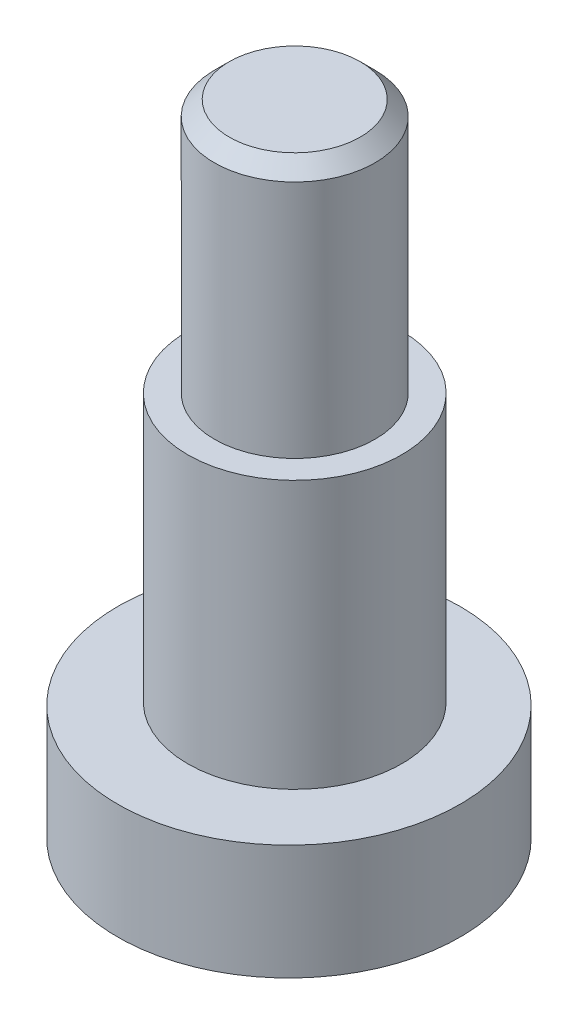
ISO-10303-21;
HEADER;
FILE_DESCRIPTION(('STEP AP214'),'2;1');
FILE_NAME('part.step','',(''),(''),'','','');
FILE_SCHEMA(('AUTOMOTIVE_DESIGN { 1 0 10303 214 1 1 1 1 }'));
ENDSEC;
DATA;
#1=APPLICATION_CONTEXT('core data for automotive mechanical design processes');
#2=APPLICATION_PROTOCOL_DEFINITION('international standard','automotive_design',2000,#1);
#3=PRODUCT_CONTEXT('',#1,'mechanical');
#4=PRODUCT('Part','Part','',(#3));
#5=PRODUCT_RELATED_PRODUCT_CATEGORY('part','',(#4));
#6=PRODUCT_DEFINITION_FORMATION('','',#4);
#7=PRODUCT_DEFINITION_CONTEXT('part definition',#1,'design');
#8=PRODUCT_DEFINITION('design','',#6,#7);
#9=PRODUCT_DEFINITION_SHAPE('','',#8);
#10=(LENGTH_UNIT() NAMED_UNIT(*) SI_UNIT(.MILLI.,.METRE.));
#11=(NAMED_UNIT(*) PLANE_ANGLE_UNIT() SI_UNIT($,.RADIAN.));
#12=(NAMED_UNIT(*) SI_UNIT($,.STERADIAN.) SOLID_ANGLE_UNIT());
#13=UNCERTAINTY_MEASURE_WITH_UNIT(LENGTH_MEASURE(1.E-05),#10,'distance_accuracy_value','');
#14=(GEOMETRIC_REPRESENTATION_CONTEXT(3) GLOBAL_UNCERTAINTY_ASSIGNED_CONTEXT((#13)) GLOBAL_UNIT_ASSIGNED_CONTEXT((#10,
#11,#12)) REPRESENTATION_CONTEXT('',''));
#15=CARTESIAN_POINT('',(0.,0.,0.));
#16=DIRECTION('',(0.,0.,1.));
#17=DIRECTION('',(1.,0.,0.));
#18=AXIS2_PLACEMENT_3D('',#15,#16,#17);
#19=CARTESIAN_POINT('',(0.,4.3,0.216468968283874));
#20=DIRECTION('',(0.,-1.,0.));
#21=DIRECTION('',(0.,0.,-1.));
#22=AXIS2_PLACEMENT_3D('',#19,#20,#21);
#23=CYLINDRICAL_SURFACE('',#22,6.4);
#24=CARTESIAN_POINT('',(0.,4.3,0.216468968283874));
#25=DIRECTION('',(0.,1.,0.));
#26=DIRECTION('',(0.,0.,1.));
#27=AXIS2_PLACEMENT_3D('',#24,#25,#26);
#28=CIRCLE('',#27,6.4);
#29=CARTESIAN_POINT('',(0.,4.3,-6.18353103171613));
#30=VERTEX_POINT('',#29);
#31=EDGE_CURVE('E163',#30,#30,#28,.T.);
#32=CARTESIAN_POINT('',(0.,0.,0.216468968283874));
#33=DIRECTION('',(0.,1.,0.));
#34=DIRECTION('',(0.,0.,1.));
#35=AXIS2_PLACEMENT_3D('',#32,#33,#34);
#36=CIRCLE('',#35,6.4);
#37=CARTESIAN_POINT('',(0.,0.,-6.18353103171613));
#38=VERTEX_POINT('',#37);
#39=EDGE_CURVE('E48',#38,#38,#36,.T.);
#40=CARTESIAN_POINT('',(0.,4.3,-6.18353103171613));
#41=CARTESIAN_POINT('',(0.,4.25520833333333,-6.18353103171613));
#42=CARTESIAN_POINT('',(0.,4.21041666666667,-6.18353103171613));
#43=CARTESIAN_POINT('',(0.,4.12083333333333,-6.18353103171613));
#44=CARTESIAN_POINT('',(0.,4.07604166666667,-6.18353103171613));
#45=CARTESIAN_POINT('',(0.,3.98645833333333,-6.18353103171613));
#46=CARTESIAN_POINT('',(0.,3.94166666666667,-6.18353103171613));
#47=CARTESIAN_POINT('',(0.,3.85208333333333,-6.18353103171613));
#48=CARTESIAN_POINT('',(0.,3.80729166666667,-6.18353103171613));
#49=CARTESIAN_POINT('',(0.,3.71770833333333,-6.18353103171613));
#50=CARTESIAN_POINT('',(0.,3.67291666666667,-6.18353103171613));
#51=CARTESIAN_POINT('',(0.,3.58333333333333,-6.18353103171613));
#52=CARTESIAN_POINT('',(0.,3.53854166666667,-6.18353103171613));
#53=CARTESIAN_POINT('',(0.,3.44895833333333,-6.18353103171613));
#54=CARTESIAN_POINT('',(0.,3.40416666666667,-6.18353103171613));
#55=CARTESIAN_POINT('',(0.,3.31458333333333,-6.18353103171613));
#56=CARTESIAN_POINT('',(0.,3.26979166666667,-6.18353103171613));
#57=CARTESIAN_POINT('',(0.,3.18020833333333,-6.18353103171613));
#58=CARTESIAN_POINT('',(0.,3.13541666666667,-6.18353103171613));
#59=CARTESIAN_POINT('',(0.,3.04583333333333,-6.18353103171613));
#60=CARTESIAN_POINT('',(0.,3.00104166666667,-6.18353103171613));
#61=CARTESIAN_POINT('',(0.,2.91145833333333,-6.18353103171613));
#62=CARTESIAN_POINT('',(0.,2.86666666666667,-6.18353103171613));
#63=CARTESIAN_POINT('',(0.,2.77708333333333,-6.18353103171613));
#64=CARTESIAN_POINT('',(0.,2.73229166666667,-6.18353103171613));
#65=CARTESIAN_POINT('',(0.,2.64270833333333,-6.18353103171613));
#66=CARTESIAN_POINT('',(0.,2.59791666666667,-6.18353103171613));
#67=CARTESIAN_POINT('',(0.,2.50833333333333,-6.18353103171613));
#68=CARTESIAN_POINT('',(0.,2.46354166666667,-6.18353103171613));
#69=CARTESIAN_POINT('',(0.,2.37395833333333,-6.18353103171613));
#70=CARTESIAN_POINT('',(0.,2.32916666666667,-6.18353103171613));
#71=CARTESIAN_POINT('',(0.,2.23958333333333,-6.18353103171613));
#72=CARTESIAN_POINT('',(0.,2.19479166666667,-6.18353103171613));
#73=CARTESIAN_POINT('',(0.,2.10520833333333,-6.18353103171613));
#74=CARTESIAN_POINT('',(0.,2.06041666666667,-6.18353103171613));
#75=CARTESIAN_POINT('',(0.,1.97083333333333,-6.18353103171613));
#76=CARTESIAN_POINT('',(0.,1.92604166666667,-6.18353103171613));
#77=CARTESIAN_POINT('',(0.,1.83645833333333,-6.18353103171613));
#78=CARTESIAN_POINT('',(0.,1.79166666666667,-6.18353103171613));
#79=CARTESIAN_POINT('',(0.,1.70208333333333,-6.18353103171613));
#80=CARTESIAN_POINT('',(0.,1.65729166666667,-6.18353103171613));
#81=CARTESIAN_POINT('',(0.,1.56770833333333,-6.18353103171613));
#82=CARTESIAN_POINT('',(0.,1.52291666666667,-6.18353103171613));
#83=CARTESIAN_POINT('',(0.,1.43333333333333,-6.18353103171613));
#84=CARTESIAN_POINT('',(0.,1.38854166666667,-6.18353103171613));
#85=CARTESIAN_POINT('',(0.,1.29895833333333,-6.18353103171613));
#86=CARTESIAN_POINT('',(0.,1.25416666666667,-6.18353103171613));
#87=CARTESIAN_POINT('',(0.,1.16458333333333,-6.18353103171613));
#88=CARTESIAN_POINT('',(0.,1.11979166666667,-6.18353103171613));
#89=CARTESIAN_POINT('',(0.,1.03020833333333,-6.18353103171613));
#90=CARTESIAN_POINT('',(0.,0.985416666666665,-6.18353103171613));
#91=CARTESIAN_POINT('',(0.,0.895833333333332,-6.18353103171613));
#92=CARTESIAN_POINT('',(0.,0.851041666666665,-6.18353103171613));
#93=CARTESIAN_POINT('',(0.,0.761458333333332,-6.18353103171613));
#94=CARTESIAN_POINT('',(0.,0.716666666666665,-6.18353103171613));
#95=CARTESIAN_POINT('',(0.,0.627083333333332,-6.18353103171613));
#96=CARTESIAN_POINT('',(0.,0.582291666666665,-6.18353103171613));
#97=CARTESIAN_POINT('',(0.,0.492708333333332,-6.18353103171613));
#98=CARTESIAN_POINT('',(0.,0.447916666666665,-6.18353103171613));
#99=CARTESIAN_POINT('',(0.,0.358333333333332,-6.18353103171613));
#100=CARTESIAN_POINT('',(0.,0.313541666666666,-6.18353103171613));
#101=CARTESIAN_POINT('',(0.,0.223958333333332,-6.18353103171613));
#102=CARTESIAN_POINT('',(0.,0.179166666666666,-6.18353103171613));
#103=CARTESIAN_POINT('',(0.,0.0895833333333324,-6.18353103171613));
#104=CARTESIAN_POINT('',(0.,0.0447916666666658,-6.18353103171613));
#105=CARTESIAN_POINT('',(0.,0.,-6.18353103171613));
#106=B_SPLINE_CURVE_WITH_KNOTS('',3,(#40,#41,#42,#43,#44,#45,#46,#47,#48,#49,#50,#51,#52,#53,
#54,#55,#56,#57,#58,#59,#60,#61,#62,#63,#64,#65,#66,#67,#68,#69,#70,#71,#72,#73,#74,#75,#76,#77,
#78,#79,#80,#81,#82,#83,#84,#85,#86,#87,#88,#89,#90,#91,#92,#93,#94,#95,#96,#97,#98,#99,#100,
#101,#102,#103,#104,#105),.UNSPECIFIED.,.F.,.F.,(4,2,2,2,2,2,2,2,2,2,2,2,2,2,2,2,2,2,2,2,2,2,2,
2,2,2,2,2,2,2,2,2,4),(0.,0.134375000000001,0.268750000000001,0.403125000000001,
0.537500000000001,0.671875000000001,0.806250000000001,0.940625,1.075,1.209375,1.34375,1.478125,
1.6125,1.746875,1.88125,2.015625,2.15,2.284375,2.41875,2.553125,2.6875,2.821875,2.95625,
3.090625,3.225,3.359375,3.49375,3.628125,3.7625,3.896875,4.03125,4.165625,4.3),.UNSPECIFIED.);
#107=EDGE_CURVE('BSEAM45',#30,#38,#106,.T.);
#108=ORIENTED_EDGE('',*,*,#31,.F.);
#109=ORIENTED_EDGE('',*,*,#39,.T.);
#110=ORIENTED_EDGE('',*,*,#107,.T.);
#111=ORIENTED_EDGE('',*,*,#107,.F.);
#112=EDGE_LOOP('',(#108,#110,#109,#111));
#113=FACE_BOUND('',#112,.T.);
#114=ADVANCED_FACE('F45',(#113),#23,.T.);
#115=CARTESIAN_POINT('',(0.,4.3,0.216468968283874));
#116=DIRECTION('',(0.,1.,0.));
#117=DIRECTION('',(0.,0.,1.));
#118=AXIS2_PLACEMENT_3D('',#115,#116,#117);
#119=PLANE('',#118);
#120=CARTESIAN_POINT('',(0.,4.3,0.));
#121=DIRECTION('',(0.,1.,0.));
#122=DIRECTION('',(0.,0.,1.));
#123=AXIS2_PLACEMENT_3D('',#120,#121,#122);
#124=CIRCLE('',#123,4.);
#125=CARTESIAN_POINT('',(0.,4.3,4.));
#126=VERTEX_POINT('',#125);
#127=EDGE_CURVE('E53',#126,#126,#124,.T.);
#128=ORIENTED_EDGE('',*,*,#127,.F.);
#129=EDGE_LOOP('',(#128));
#130=FACE_BOUND('',#129,.T.);
#131=ORIENTED_EDGE('',*,*,#31,.T.);
#132=EDGE_LOOP('',(#131));
#133=FACE_BOUND('',#132,.T.);
#134=ADVANCED_FACE('F174',(#130,#133),#119,.T.);
#135=CARTESIAN_POINT('',(0.,0.,0.216468968283874));
#136=DIRECTION('',(0.,1.,0.));
#137=DIRECTION('',(0.,0.,1.));
#138=AXIS2_PLACEMENT_3D('',#135,#136,#137);
#139=PLANE('',#138);
#140=DIRECTION('',(-0.5,0.,0.866025403784439));
#141=VECTOR('',#140,1.);
#142=CARTESIAN_POINT('',(1.8475208614068,0.,0.));
#143=LINE('',#142,#141);
#144=CARTESIAN_POINT('',(1.8475208614068,0.,0.));
#145=VERTEX_POINT('',#144);
#146=CARTESIAN_POINT('',(0.923760430703402,0.,1.6));
#147=VERTEX_POINT('',#146);
#148=EDGE_CURVE('E135',#145,#147,#143,.T.);
#149=ORIENTED_EDGE('',*,*,#148,.F.);
#150=DIRECTION('',(0.5,0.,0.866025403784439));
#151=VECTOR('',#150,1.);
#152=CARTESIAN_POINT('',(0.923760430703402,0.,-1.6));
#153=LINE('',#152,#151);
#154=CARTESIAN_POINT('',(0.923760430703402,0.,-1.6));
#155=VERTEX_POINT('',#154);
#156=EDGE_CURVE('E61',#155,#145,#153,.T.);
#157=ORIENTED_EDGE('',*,*,#156,.F.);
#158=DIRECTION('',(1.,0.,0.));
#159=VECTOR('',#158,1.);
#160=CARTESIAN_POINT('',(-0.923760430703402,0.,-1.6));
#161=LINE('',#160,#159);
#162=CARTESIAN_POINT('',(-0.923760430703402,0.,-1.6));
#163=VERTEX_POINT('',#162);
#164=EDGE_CURVE('E144',#163,#155,#161,.T.);
#165=ORIENTED_EDGE('',*,*,#164,.F.);
#166=DIRECTION('',(0.5,0.,-0.866025403784439));
#167=VECTOR('',#166,1.);
#168=CARTESIAN_POINT('',(-1.8475208614068,0.,0.));
#169=LINE('',#168,#167);
#170=CARTESIAN_POINT('',(-1.8475208614068,0.,0.));
#171=VERTEX_POINT('',#170);
#172=EDGE_CURVE('E142',#171,#163,#169,.T.);
#173=ORIENTED_EDGE('',*,*,#172,.F.);
#174=DIRECTION('',(-0.5,0.,-0.866025403784439));
#175=VECTOR('',#174,1.);
#176=CARTESIAN_POINT('',(-0.923760430703402,0.,1.6));
#177=LINE('',#176,#175);
#178=CARTESIAN_POINT('',(-0.923760430703402,0.,1.6));
#179=VERTEX_POINT('',#178);
#180=EDGE_CURVE('E109',#179,#171,#177,.T.);
#181=ORIENTED_EDGE('',*,*,#180,.F.);
#182=DIRECTION('',(-1.,0.,0.));
#183=VECTOR('',#182,1.);
#184=CARTESIAN_POINT('',(0.923760430703402,0.,1.6));
#185=LINE('',#184,#183);
#186=EDGE_CURVE('E138',#147,#179,#185,.T.);
#187=ORIENTED_EDGE('',*,*,#186,.F.);
#188=EDGE_LOOP('',(#149,#157,#165,#173,#181,#187));
#189=FACE_BOUND('',#188,.T.);
#190=ORIENTED_EDGE('',*,*,#39,.F.);
#191=EDGE_LOOP('',(#190));
#192=FACE_BOUND('',#191,.T.);
#193=ADVANCED_FACE('F171',(#189,#192),#139,.F.);
#194=CARTESIAN_POINT('',(0.,14.3,0.));
#195=DIRECTION('',(0.,-1.,0.));
#196=DIRECTION('',(0.,0.,-1.));
#197=AXIS2_PLACEMENT_3D('',#194,#195,#196);
#198=CYLINDRICAL_SURFACE('',#197,4.);
#199=CARTESIAN_POINT('',(0.,14.3,0.));
#200=DIRECTION('',(0.,1.,0.));
#201=DIRECTION('',(0.,0.,1.));
#202=AXIS2_PLACEMENT_3D('',#199,#200,#201);
#203=CIRCLE('',#202,4.);
#204=CARTESIAN_POINT('',(0.,14.3,4.));
#205=VERTEX_POINT('',#204);
#206=EDGE_CURVE('E158',#205,#205,#203,.T.);
#207=ORIENTED_EDGE('',*,*,#206,.F.);
#208=EDGE_LOOP('',(#207));
#209=FACE_BOUND('',#208,.T.);
#210=ORIENTED_EDGE('',*,*,#127,.T.);
#211=EDGE_LOOP('',(#210));
#212=FACE_BOUND('',#211,.T.);
#213=ADVANCED_FACE('F173',(#209,#212),#198,.T.);
#214=CARTESIAN_POINT('',(0.,14.3,0.));
#215=DIRECTION('',(0.,1.,0.));
#216=DIRECTION('',(0.,0.,1.));
#217=AXIS2_PLACEMENT_3D('',#214,#215,#216);
#218=PLANE('',#217);
#219=CARTESIAN_POINT('',(0.,14.3,0.));
#220=DIRECTION('',(0.,1.,0.));
#221=DIRECTION('',(0.,0.,1.));
#222=AXIS2_PLACEMENT_3D('',#219,#220,#221);
#223=CIRCLE('',#222,3.);
#224=CARTESIAN_POINT('',(0.,14.3,3.));
#225=VERTEX_POINT('',#224);
#226=EDGE_CURVE('E11',#225,#225,#223,.T.);
#227=ORIENTED_EDGE('',*,*,#226,.F.);
#228=EDGE_LOOP('',(#227));
#229=FACE_BOUND('',#228,.T.);
#230=ORIENTED_EDGE('',*,*,#206,.T.);
#231=EDGE_LOOP('',(#230));
#232=FACE_BOUND('',#231,.T.);
#233=ADVANCED_FACE('F181',(#229,#232),#218,.T.);
#234=CARTESIAN_POINT('',(0.,23.8,0.));
#235=DIRECTION('',(0.,-1.,0.));
#236=DIRECTION('',(0.,0.,-1.));
#237=AXIS2_PLACEMENT_3D('',#234,#235,#236);
#238=CYLINDRICAL_SURFACE('',#237,3.);
#239=CARTESIAN_POINT('',(0.,23.2455,0.));
#240=DIRECTION('',(0.,-1.,0.));
#241=DIRECTION('',(0.,0.,-1.));
#242=AXIS2_PLACEMENT_3D('',#239,#240,#241);
#243=CIRCLE('',#242,3.);
#244=CARTESIAN_POINT('',(0.,23.2455,-3.));
#245=VERTEX_POINT('',#244);
#246=EDGE_CURVE('E156',#245,#245,#243,.T.);
#247=ORIENTED_EDGE('',*,*,#246,.T.);
#248=EDGE_LOOP('',(#247));
#249=FACE_BOUND('',#248,.T.);
#250=ORIENTED_EDGE('',*,*,#226,.T.);
#251=EDGE_LOOP('',(#250));
#252=FACE_BOUND('',#251,.T.);
#253=ADVANCED_FACE('F209',(#249,#252),#238,.T.);
#254=CARTESIAN_POINT('',(0.,23.8,0.));
#255=DIRECTION('',(0.,-1.,0.));
#256=DIRECTION('',(0.,0.,-1.));
#257=AXIS2_PLACEMENT_3D('',#254,#255,#256);
#258=CONICAL_SURFACE('',#257,2.4455,0.785398163397464);
#259=ORIENTED_EDGE('',*,*,#246,.F.);
#260=EDGE_LOOP('',(#259));
#261=FACE_BOUND('',#260,.T.);
#262=CARTESIAN_POINT('',(0.,23.8,0.));
#263=DIRECTION('',(0.,-1.,0.));
#264=DIRECTION('',(0.,0.,-1.));
#265=AXIS2_PLACEMENT_3D('',#262,#263,#264);
#266=CIRCLE('',#265,2.4455);
#267=CARTESIAN_POINT('',(0.,23.8,-2.4455));
#268=VERTEX_POINT('',#267);
#269=EDGE_CURVE('E148',#268,#268,#266,.T.);
#270=ORIENTED_EDGE('',*,*,#269,.T.);
#271=EDGE_LOOP('',(#270));
#272=FACE_BOUND('',#271,.T.);
#273=ADVANCED_FACE('F220',(#261,#272),#258,.T.);
#274=CARTESIAN_POINT('',(0.,23.8,0.));
#275=DIRECTION('',(0.,1.,0.));
#276=DIRECTION('',(0.,0.,1.));
#277=AXIS2_PLACEMENT_3D('',#274,#275,#276);
#278=PLANE('',#277);
#279=ORIENTED_EDGE('',*,*,#269,.F.);
#280=EDGE_LOOP('',(#279));
#281=FACE_BOUND('',#280,.T.);
#282=ADVANCED_FACE('F231',(#281),#278,.T.);
#283=CARTESIAN_POINT('',(0.923760430703402,2.,-1.6));
#284=DIRECTION('',(0.866025403784439,0.,-0.5));
#285=DIRECTION('',(-0.5,0.,-0.866025403784439));
#286=AXIS2_PLACEMENT_3D('',#283,#284,#285);
#287=PLANE('',#286);
#288=ORIENTED_EDGE('',*,*,#156,.T.);
#289=DIRECTION('',(0.,-1.,0.));
#290=VECTOR('',#289,1.);
#291=CARTESIAN_POINT('',(1.8475208614068,2.,0.));
#292=LINE('',#291,#290);
#293=CARTESIAN_POINT('',(1.8475208614068,2.,0.));
#294=VERTEX_POINT('',#293);
#295=EDGE_CURVE('E91',#294,#145,#292,.T.);
#296=ORIENTED_EDGE('',*,*,#295,.F.);
#297=DIRECTION('',(0.5,0.,0.866025403784439));
#298=VECTOR('',#297,1.);
#299=CARTESIAN_POINT('',(0.923760430703402,2.,-1.6));
#300=LINE('',#299,#298);
#301=CARTESIAN_POINT('',(0.923760430703402,2.,-1.6));
#302=VERTEX_POINT('',#301);
#303=EDGE_CURVE('E146',#302,#294,#300,.T.);
#304=ORIENTED_EDGE('',*,*,#303,.F.);
#305=DIRECTION('',(0.,-1.,0.));
#306=VECTOR('',#305,1.);
#307=CARTESIAN_POINT('',(0.923760430703402,2.,-1.6));
#308=LINE('',#307,#306);
#309=EDGE_CURVE('E69',#302,#155,#308,.T.);
#310=ORIENTED_EDGE('',*,*,#309,.T.);
#311=EDGE_LOOP('',(#288,#296,#304,#310));
#312=FACE_BOUND('',#311,.T.);
#313=ADVANCED_FACE('F240',(#312),#287,.F.);
#314=CARTESIAN_POINT('',(-0.923760430703402,2.,-1.6));
#315=DIRECTION('',(0.,0.,-1.));
#316=DIRECTION('',(-1.,0.,0.));
#317=AXIS2_PLACEMENT_3D('',#314,#315,#316);
#318=PLANE('',#317);
#319=ORIENTED_EDGE('',*,*,#164,.T.);
#320=ORIENTED_EDGE('',*,*,#309,.F.);
#321=DIRECTION('',(1.,0.,0.));
#322=VECTOR('',#321,1.);
#323=CARTESIAN_POINT('',(-0.923760430703402,2.,-1.6));
#324=LINE('',#323,#322);
#325=CARTESIAN_POINT('',(-0.923760430703402,2.,-1.6));
#326=VERTEX_POINT('',#325);
#327=EDGE_CURVE('E121',#326,#302,#324,.T.);
#328=ORIENTED_EDGE('',*,*,#327,.F.);
#329=DIRECTION('',(0.,-1.,0.));
#330=VECTOR('',#329,1.);
#331=CARTESIAN_POINT('',(-0.923760430703402,2.,-1.6));
#332=LINE('',#331,#330);
#333=EDGE_CURVE('E113',#326,#163,#332,.T.);
#334=ORIENTED_EDGE('',*,*,#333,.T.);
#335=EDGE_LOOP('',(#319,#320,#328,#334));
#336=FACE_BOUND('',#335,.T.);
#337=ADVANCED_FACE('F251',(#336),#318,.F.);
#338=CARTESIAN_POINT('',(-1.8475208614068,2.,0.));
#339=DIRECTION('',(-0.866025403784439,0.,-0.5));
#340=DIRECTION('',(-0.5,0.,0.866025403784439));
#341=AXIS2_PLACEMENT_3D('',#338,#339,#340);
#342=PLANE('',#341);
#343=ORIENTED_EDGE('',*,*,#172,.T.);
#344=ORIENTED_EDGE('',*,*,#333,.F.);
#345=DIRECTION('',(0.5,0.,-0.866025403784439));
#346=VECTOR('',#345,1.);
#347=CARTESIAN_POINT('',(-1.8475208614068,2.,0.));
#348=LINE('',#347,#346);
#349=CARTESIAN_POINT('',(-1.8475208614068,2.,0.));
#350=VERTEX_POINT('',#349);
#351=EDGE_CURVE('E117',#350,#326,#348,.T.);
#352=ORIENTED_EDGE('',*,*,#351,.F.);
#353=DIRECTION('',(0.,-1.,0.));
#354=VECTOR('',#353,1.);
#355=CARTESIAN_POINT('',(-1.8475208614068,2.,0.));
#356=LINE('',#355,#354);
#357=EDGE_CURVE('E102',#350,#171,#356,.T.);
#358=ORIENTED_EDGE('',*,*,#357,.T.);
#359=EDGE_LOOP('',(#343,#344,#352,#358));
#360=FACE_BOUND('',#359,.T.);
#361=ADVANCED_FACE('F118',(#360),#342,.F.);
#362=CARTESIAN_POINT('',(-0.923760430703402,2.,1.6));
#363=DIRECTION('',(-0.866025403784439,0.,0.5));
#364=DIRECTION('',(0.5,0.,0.866025403784439));
#365=AXIS2_PLACEMENT_3D('',#362,#363,#364);
#366=PLANE('',#365);
#367=ORIENTED_EDGE('',*,*,#180,.T.);
#368=ORIENTED_EDGE('',*,*,#357,.F.);
#369=DIRECTION('',(-0.5,0.,-0.866025403784439));
#370=VECTOR('',#369,1.);
#371=CARTESIAN_POINT('',(-0.923760430703402,2.,1.6));
#372=LINE('',#371,#370);
#373=CARTESIAN_POINT('',(-0.923760430703402,2.,1.6));
#374=VERTEX_POINT('',#373);
#375=EDGE_CURVE('E106',#374,#350,#372,.T.);
#376=ORIENTED_EDGE('',*,*,#375,.F.);
#377=DIRECTION('',(0.,-1.,0.));
#378=VECTOR('',#377,1.);
#379=CARTESIAN_POINT('',(-0.923760430703402,2.,1.6));
#380=LINE('',#379,#378);
#381=EDGE_CURVE('E114',#374,#179,#380,.T.);
#382=ORIENTED_EDGE('',*,*,#381,.T.);
#383=EDGE_LOOP('',(#367,#368,#376,#382));
#384=FACE_BOUND('',#383,.T.);
#385=ADVANCED_FACE('F104',(#384),#366,.F.);
#386=CARTESIAN_POINT('',(0.923760430703402,2.,1.6));
#387=DIRECTION('',(0.,0.,1.));
#388=DIRECTION('',(1.,0.,0.));
#389=AXIS2_PLACEMENT_3D('',#386,#387,#388);
#390=PLANE('',#389);
#391=ORIENTED_EDGE('',*,*,#186,.T.);
#392=ORIENTED_EDGE('',*,*,#381,.F.);
#393=DIRECTION('',(-1.,0.,0.));
#394=VECTOR('',#393,1.);
#395=CARTESIAN_POINT('',(0.923760430703402,2.,1.6));
#396=LINE('',#395,#394);
#397=CARTESIAN_POINT('',(0.923760430703402,2.,1.6));
#398=VERTEX_POINT('',#397);
#399=EDGE_CURVE('E127',#398,#374,#396,.T.);
#400=ORIENTED_EDGE('',*,*,#399,.F.);
#401=DIRECTION('',(0.,-1.,0.));
#402=VECTOR('',#401,1.);
#403=CARTESIAN_POINT('',(0.923760430703402,2.,1.6));
#404=LINE('',#403,#402);
#405=EDGE_CURVE('E151',#398,#147,#404,.T.);
#406=ORIENTED_EDGE('',*,*,#405,.T.);
#407=EDGE_LOOP('',(#391,#392,#400,#406));
#408=FACE_BOUND('',#407,.T.);
#409=ADVANCED_FACE('F273',(#408),#390,.F.);
#410=CARTESIAN_POINT('',(1.8475208614068,2.,0.));
#411=DIRECTION('',(0.866025403784439,0.,0.5));
#412=DIRECTION('',(0.5,0.,-0.866025403784439));
#413=AXIS2_PLACEMENT_3D('',#410,#411,#412);
#414=PLANE('',#413);
#415=ORIENTED_EDGE('',*,*,#148,.T.);
#416=ORIENTED_EDGE('',*,*,#405,.F.);
#417=DIRECTION('',(-0.5,0.,0.866025403784439));
#418=VECTOR('',#417,1.);
#419=CARTESIAN_POINT('',(1.8475208614068,2.,0.));
#420=LINE('',#419,#418);
#421=EDGE_CURVE('E129',#294,#398,#420,.T.);
#422=ORIENTED_EDGE('',*,*,#421,.F.);
#423=ORIENTED_EDGE('',*,*,#295,.T.);
#424=EDGE_LOOP('',(#415,#416,#422,#423));
#425=FACE_BOUND('',#424,.T.);
#426=ADVANCED_FACE('F281',(#425),#414,.F.);
#427=CARTESIAN_POINT('',(0.,2.,0.));
#428=DIRECTION('',(0.,-1.,0.));
#429=DIRECTION('',(0.,0.,-1.));
#430=AXIS2_PLACEMENT_3D('',#427,#428,#429);
#431=PLANE('',#430);
#432=ORIENTED_EDGE('',*,*,#303,.T.);
#433=ORIENTED_EDGE('',*,*,#421,.T.);
#434=ORIENTED_EDGE('',*,*,#399,.T.);
#435=ORIENTED_EDGE('',*,*,#375,.T.);
#436=ORIENTED_EDGE('',*,*,#351,.T.);
#437=ORIENTED_EDGE('',*,*,#327,.T.);
#438=EDGE_LOOP('',(#432,#433,#434,#435,#436,#437));
#439=FACE_BOUND('',#438,.T.);
#440=ADVANCED_FACE('F124',(#439),#431,.T.);
#441=CLOSED_SHELL('',(#114,#134,#193,#213,#233,#253,#273,#282,#313,#337,#361,#385,#409,#426,#440));
#442=MANIFOLD_SOLID_BREP('B2',#441);
#443=ADVANCED_BREP_SHAPE_REPRESENTATION('',(#18,#442),#14);
#444=SHAPE_DEFINITION_REPRESENTATION(#9,#443);
ENDSEC;
END-ISO-10303-21;
